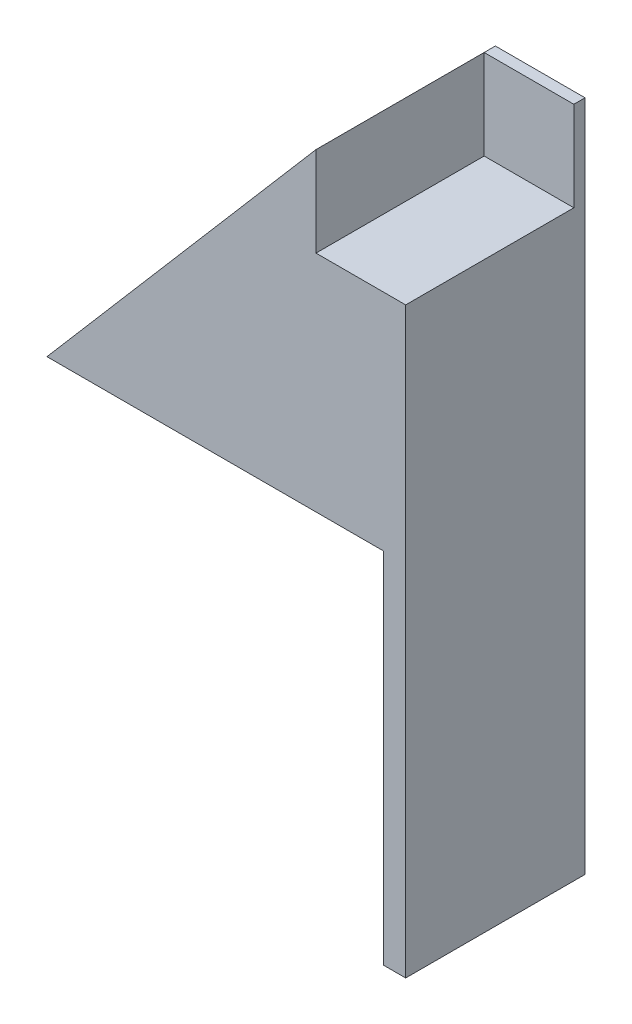
ISO-10303-21;
HEADER;
FILE_DESCRIPTION(('STEP AP214'),'2;1');
FILE_NAME('part.step','',(''),(''),'','','');
FILE_SCHEMA(('AUTOMOTIVE_DESIGN { 1 0 10303 214 1 1 1 1 }'));
ENDSEC;
DATA;
#1=APPLICATION_CONTEXT('core data for automotive mechanical design processes');
#2=APPLICATION_PROTOCOL_DEFINITION('international standard','automotive_design',2000,#1);
#3=PRODUCT_CONTEXT('',#1,'mechanical');
#4=PRODUCT('Part','Part','',(#3));
#5=PRODUCT_RELATED_PRODUCT_CATEGORY('part','',(#4));
#6=PRODUCT_DEFINITION_FORMATION('','',#4);
#7=PRODUCT_DEFINITION_CONTEXT('part definition',#1,'design');
#8=PRODUCT_DEFINITION('design','',#6,#7);
#9=PRODUCT_DEFINITION_SHAPE('','',#8);
#10=(LENGTH_UNIT() NAMED_UNIT(*) SI_UNIT(.MILLI.,.METRE.));
#11=(NAMED_UNIT(*) PLANE_ANGLE_UNIT() SI_UNIT($,.RADIAN.));
#12=(NAMED_UNIT(*) SI_UNIT($,.STERADIAN.) SOLID_ANGLE_UNIT());
#13=UNCERTAINTY_MEASURE_WITH_UNIT(LENGTH_MEASURE(1.E-05),#10,'distance_accuracy_value','');
#14=(GEOMETRIC_REPRESENTATION_CONTEXT(3) GLOBAL_UNCERTAINTY_ASSIGNED_CONTEXT((#13)) GLOBAL_UNIT_ASSIGNED_CONTEXT((#10,
#11,#12)) REPRESENTATION_CONTEXT('',''));
#15=CARTESIAN_POINT('',(0.,0.,0.));
#16=DIRECTION('',(0.,0.,1.));
#17=DIRECTION('',(1.,0.,0.));
#18=AXIS2_PLACEMENT_3D('',#15,#16,#17);
#19=CARTESIAN_POINT('',(9.525,44.45,12.7));
#20=DIRECTION('',(0.,-1.,0.));
#21=DIRECTION('',(0.,0.,-1.));
#22=AXIS2_PLACEMENT_3D('',#19,#20,#21);
#23=PLANE('',#22);
#24=DIRECTION('',(-1.,0.,0.));
#25=VECTOR('',#24,1.);
#26=CARTESIAN_POINT('',(9.525,44.45,-11.1125));
#27=LINE('',#26,#25);
#28=CARTESIAN_POINT('',(22.225,44.45,-11.1125));
#29=VERTEX_POINT('',#28);
#30=CARTESIAN_POINT('',(9.525,44.45,-11.1125));
#31=VERTEX_POINT('',#30);
#32=EDGE_CURVE('E116',#29,#31,#27,.T.);
#33=ORIENTED_EDGE('',*,*,#32,.F.);
#34=DIRECTION('',(0.,0.,-1.));
#35=VECTOR('',#34,1.);
#36=CARTESIAN_POINT('',(22.225,44.45,12.7));
#37=LINE('',#36,#35);
#38=CARTESIAN_POINT('',(22.225,44.45,-12.7));
#39=VERTEX_POINT('',#38);
#40=EDGE_CURVE('E11',#29,#39,#37,.T.);
#41=ORIENTED_EDGE('',*,*,#40,.T.);
#42=DIRECTION('',(-1.,0.,0.));
#43=VECTOR('',#42,1.);
#44=CARTESIAN_POINT('',(9.525,44.45,-12.7));
#45=LINE('',#44,#43);
#46=CARTESIAN_POINT('',(9.525,44.45,-12.7));
#47=VERTEX_POINT('',#46);
#48=EDGE_CURVE('E148',#39,#47,#45,.T.);
#49=ORIENTED_EDGE('',*,*,#48,.T.);
#50=DIRECTION('',(0.,0.,-1.));
#51=VECTOR('',#50,1.);
#52=CARTESIAN_POINT('',(9.525,44.45,12.7));
#53=LINE('',#52,#51);
#54=EDGE_CURVE('E168',#31,#47,#53,.T.);
#55=ORIENTED_EDGE('',*,*,#54,.F.);
#56=EDGE_LOOP('',(#33,#41,#49,#55));
#57=FACE_BOUND('',#56,.T.);
#58=ADVANCED_FACE('F33',(#57),#23,.F.);
#59=CARTESIAN_POINT('',(22.225,44.45,12.7));
#60=DIRECTION('',(-1.,0.,0.));
#61=DIRECTION('',(0.,0.,1.));
#62=AXIS2_PLACEMENT_3D('',#59,#60,#61);
#63=PLANE('',#62);
#64=DIRECTION('',(0.,1.,0.));
#65=VECTOR('',#64,1.);
#66=CARTESIAN_POINT('',(22.225,44.45,-11.1125));
#67=LINE('',#66,#65);
#68=CARTESIAN_POINT('',(22.225,31.75,-11.1125));
#69=VERTEX_POINT('',#68);
#70=EDGE_CURVE('E124',#69,#29,#67,.T.);
#71=ORIENTED_EDGE('',*,*,#70,.F.);
#72=DIRECTION('',(0.,0.,1.));
#73=VECTOR('',#72,1.);
#74=CARTESIAN_POINT('',(22.225,31.75,-11.1125));
#75=LINE('',#74,#73);
#76=CARTESIAN_POINT('',(22.225,31.75,12.7));
#77=VERTEX_POINT('',#76);
#78=EDGE_CURVE('E115',#69,#77,#75,.T.);
#79=ORIENTED_EDGE('',*,*,#78,.T.);
#80=DIRECTION('',(0.,1.,0.));
#81=VECTOR('',#80,1.);
#82=CARTESIAN_POINT('',(22.225,31.75,12.7));
#83=LINE('',#82,#81);
#84=CARTESIAN_POINT('',(22.225,-50.8,12.7));
#85=VERTEX_POINT('',#84);
#86=EDGE_CURVE('E137',#85,#77,#83,.T.);
#87=ORIENTED_EDGE('',*,*,#86,.F.);
#88=DIRECTION('',(0.,0.,-1.));
#89=VECTOR('',#88,1.);
#90=CARTESIAN_POINT('',(22.225,-50.8,12.7));
#91=LINE('',#90,#89);
#92=CARTESIAN_POINT('',(22.225,-50.8,-12.7));
#93=VERTEX_POINT('',#92);
#94=EDGE_CURVE('E146',#85,#93,#91,.T.);
#95=ORIENTED_EDGE('',*,*,#94,.T.);
#96=DIRECTION('',(0.,1.,0.));
#97=VECTOR('',#96,1.);
#98=CARTESIAN_POINT('',(22.225,44.45,-12.7));
#99=LINE('',#98,#97);
#100=EDGE_CURVE('E84',#93,#39,#99,.T.);
#101=ORIENTED_EDGE('',*,*,#100,.T.);
#102=ORIENTED_EDGE('',*,*,#40,.F.);
#103=EDGE_LOOP('',(#71,#79,#87,#95,#101,#102));
#104=FACE_BOUND('',#103,.T.);
#105=ADVANCED_FACE('F35',(#104),#63,.F.);
#106=CARTESIAN_POINT('',(9.525,44.45,12.7));
#107=DIRECTION('',(0.759256602365296,-0.650791373455968,0.));
#108=DIRECTION('',(0.650791373455969,0.759256602365297,0.));
#109=AXIS2_PLACEMENT_3D('',#106,#107,#108);
#110=PLANE('',#109);
#111=DIRECTION('',(-0.650791373455968,-0.759256602365297,0.));
#112=VECTOR('',#111,1.);
#113=CARTESIAN_POINT('',(9.525,44.45,-12.7));
#114=LINE('',#113,#112);
#115=CARTESIAN_POINT('',(-28.575,0.,-12.7));
#116=VERTEX_POINT('',#115);
#117=EDGE_CURVE('E151',#47,#116,#114,.T.);
#118=ORIENTED_EDGE('',*,*,#117,.T.);
#119=DIRECTION('',(0.,0.,-1.));
#120=VECTOR('',#119,1.);
#121=CARTESIAN_POINT('',(-28.575,0.,12.7));
#122=LINE('',#121,#120);
#123=CARTESIAN_POINT('',(-28.575,0.,12.7));
#124=VERTEX_POINT('',#123);
#125=EDGE_CURVE('E166',#124,#116,#122,.T.);
#126=ORIENTED_EDGE('',*,*,#125,.F.);
#127=DIRECTION('',(-0.650791373455968,-0.759256602365297,0.));
#128=VECTOR('',#127,1.);
#129=CARTESIAN_POINT('',(9.525,44.45,12.7));
#130=LINE('',#129,#128);
#131=CARTESIAN_POINT('',(9.525,44.45,12.7));
#132=VERTEX_POINT('',#131);
#133=EDGE_CURVE('E90',#132,#124,#130,.T.);
#134=ORIENTED_EDGE('',*,*,#133,.F.);
#135=EDGE_CURVE('E41',#132,#31,#53,.T.);
#136=ORIENTED_EDGE('',*,*,#135,.T.);
#137=ORIENTED_EDGE('',*,*,#54,.T.);
#138=EDGE_LOOP('',(#118,#126,#134,#136,#137));
#139=FACE_BOUND('',#138,.T.);
#140=ADVANCED_FACE('F171',(#139),#110,.F.);
#141=CARTESIAN_POINT('',(19.05,0.,12.7));
#142=DIRECTION('',(0.,1.,0.));
#143=DIRECTION('',(-1.,0.,0.));
#144=AXIS2_PLACEMENT_3D('',#141,#142,#143);
#145=PLANE('',#144);
#146=DIRECTION('',(1.,0.,0.));
#147=VECTOR('',#146,1.);
#148=CARTESIAN_POINT('',(19.05,0.,-12.7));
#149=LINE('',#148,#147);
#150=CARTESIAN_POINT('',(19.05,0.,-12.7));
#151=VERTEX_POINT('',#150);
#152=EDGE_CURVE('E153',#116,#151,#149,.T.);
#153=ORIENTED_EDGE('',*,*,#152,.T.);
#154=DIRECTION('',(0.,0.,-1.));
#155=VECTOR('',#154,1.);
#156=CARTESIAN_POINT('',(19.05,0.,12.7));
#157=LINE('',#156,#155);
#158=CARTESIAN_POINT('',(19.05,0.,12.7));
#159=VERTEX_POINT('',#158);
#160=EDGE_CURVE('E163',#159,#151,#157,.T.);
#161=ORIENTED_EDGE('',*,*,#160,.F.);
#162=DIRECTION('',(1.,0.,0.));
#163=VECTOR('',#162,1.);
#164=CARTESIAN_POINT('',(19.05,0.,12.7));
#165=LINE('',#164,#163);
#166=EDGE_CURVE('E141',#124,#159,#165,.T.);
#167=ORIENTED_EDGE('',*,*,#166,.F.);
#168=ORIENTED_EDGE('',*,*,#125,.T.);
#169=EDGE_LOOP('',(#153,#161,#167,#168));
#170=FACE_BOUND('',#169,.T.);
#171=ADVANCED_FACE('F180',(#170),#145,.F.);
#172=CARTESIAN_POINT('',(19.05,-50.8,12.7));
#173=DIRECTION('',(1.,0.,0.));
#174=DIRECTION('',(0.,0.,-1.));
#175=AXIS2_PLACEMENT_3D('',#172,#173,#174);
#176=PLANE('',#175);
#177=DIRECTION('',(0.,-1.,0.));
#178=VECTOR('',#177,1.);
#179=CARTESIAN_POINT('',(19.05,-50.8,-12.7));
#180=LINE('',#179,#178);
#181=CARTESIAN_POINT('',(19.05,-50.8,-12.7));
#182=VERTEX_POINT('',#181);
#183=EDGE_CURVE('E155',#151,#182,#180,.T.);
#184=ORIENTED_EDGE('',*,*,#183,.T.);
#185=DIRECTION('',(0.,0.,-1.));
#186=VECTOR('',#185,1.);
#187=CARTESIAN_POINT('',(19.05,-50.8,12.7));
#188=LINE('',#187,#186);
#189=CARTESIAN_POINT('',(19.05,-50.8,12.7));
#190=VERTEX_POINT('',#189);
#191=EDGE_CURVE('E160',#190,#182,#188,.T.);
#192=ORIENTED_EDGE('',*,*,#191,.F.);
#193=DIRECTION('',(0.,-1.,0.));
#194=VECTOR('',#193,1.);
#195=CARTESIAN_POINT('',(19.05,-50.8,12.7));
#196=LINE('',#195,#194);
#197=EDGE_CURVE('E143',#159,#190,#196,.T.);
#198=ORIENTED_EDGE('',*,*,#197,.F.);
#199=ORIENTED_EDGE('',*,*,#160,.T.);
#200=EDGE_LOOP('',(#184,#192,#198,#199));
#201=FACE_BOUND('',#200,.T.);
#202=ADVANCED_FACE('F184',(#201),#176,.F.);
#203=CARTESIAN_POINT('',(19.05,-50.8,12.7));
#204=DIRECTION('',(0.,1.,0.));
#205=DIRECTION('',(0.,0.,1.));
#206=AXIS2_PLACEMENT_3D('',#203,#204,#205);
#207=PLANE('',#206);
#208=DIRECTION('',(1.,0.,0.));
#209=VECTOR('',#208,1.);
#210=CARTESIAN_POINT('',(19.05,-50.8,-12.7));
#211=LINE('',#210,#209);
#212=EDGE_CURVE('E139',#182,#93,#211,.T.);
#213=ORIENTED_EDGE('',*,*,#212,.T.);
#214=ORIENTED_EDGE('',*,*,#94,.F.);
#215=DIRECTION('',(1.,0.,0.));
#216=VECTOR('',#215,1.);
#217=CARTESIAN_POINT('',(19.05,-50.8,12.7));
#218=LINE('',#217,#216);
#219=EDGE_CURVE('E57',#190,#85,#218,.T.);
#220=ORIENTED_EDGE('',*,*,#219,.F.);
#221=ORIENTED_EDGE('',*,*,#191,.T.);
#222=EDGE_LOOP('',(#213,#214,#220,#221));
#223=FACE_BOUND('',#222,.T.);
#224=ADVANCED_FACE('F188',(#223),#207,.F.);
#225=CARTESIAN_POINT('',(0.,0.,12.7));
#226=DIRECTION('',(0.,0.,1.));
#227=DIRECTION('',(1.,0.,0.));
#228=AXIS2_PLACEMENT_3D('',#225,#226,#227);
#229=PLANE('',#228);
#230=DIRECTION('',(0.,-1.,0.));
#231=VECTOR('',#230,1.);
#232=CARTESIAN_POINT('',(9.525,44.45,12.7));
#233=LINE('',#232,#231);
#234=CARTESIAN_POINT('',(9.525,31.75,12.7));
#235=VERTEX_POINT('',#234);
#236=EDGE_CURVE('E48',#132,#235,#233,.T.);
#237=ORIENTED_EDGE('',*,*,#236,.F.);
#238=ORIENTED_EDGE('',*,*,#133,.T.);
#239=ORIENTED_EDGE('',*,*,#166,.T.);
#240=ORIENTED_EDGE('',*,*,#197,.T.);
#241=ORIENTED_EDGE('',*,*,#219,.T.);
#242=ORIENTED_EDGE('',*,*,#86,.T.);
#243=DIRECTION('',(1.,0.,0.));
#244=VECTOR('',#243,1.);
#245=CARTESIAN_POINT('',(9.525,31.75,12.7));
#246=LINE('',#245,#244);
#247=EDGE_CURVE('E129',#235,#77,#246,.T.);
#248=ORIENTED_EDGE('',*,*,#247,.F.);
#249=EDGE_LOOP('',(#237,#238,#239,#240,#241,#242,#248));
#250=FACE_BOUND('',#249,.T.);
#251=ADVANCED_FACE('F186',(#250),#229,.T.);
#252=CARTESIAN_POINT('',(0.,0.,-12.7));
#253=DIRECTION('',(0.,0.,1.));
#254=DIRECTION('',(1.,0.,0.));
#255=AXIS2_PLACEMENT_3D('',#252,#253,#254);
#256=PLANE('',#255);
#257=ORIENTED_EDGE('',*,*,#100,.F.);
#258=ORIENTED_EDGE('',*,*,#212,.F.);
#259=ORIENTED_EDGE('',*,*,#183,.F.);
#260=ORIENTED_EDGE('',*,*,#152,.F.);
#261=ORIENTED_EDGE('',*,*,#117,.F.);
#262=ORIENTED_EDGE('',*,*,#48,.F.);
#263=EDGE_LOOP('',(#257,#258,#259,#260,#261,#262));
#264=FACE_BOUND('',#263,.T.);
#265=ADVANCED_FACE('F176',(#264),#256,.F.);
#266=CARTESIAN_POINT('',(9.525,44.45,-11.1125));
#267=DIRECTION('',(-1.,0.,0.));
#268=DIRECTION('',(0.,-1.,0.));
#269=AXIS2_PLACEMENT_3D('',#266,#267,#268);
#270=PLANE('',#269);
#271=ORIENTED_EDGE('',*,*,#236,.T.);
#272=DIRECTION('',(0.,0.,1.));
#273=VECTOR('',#272,1.);
#274=CARTESIAN_POINT('',(9.525,31.75,-11.1125));
#275=LINE('',#274,#273);
#276=CARTESIAN_POINT('',(9.525,31.75,-11.1125));
#277=VERTEX_POINT('',#276);
#278=EDGE_CURVE('E107',#277,#235,#275,.T.);
#279=ORIENTED_EDGE('',*,*,#278,.F.);
#280=DIRECTION('',(0.,-1.,0.));
#281=VECTOR('',#280,1.);
#282=CARTESIAN_POINT('',(9.525,44.45,-11.1125));
#283=LINE('',#282,#281);
#284=EDGE_CURVE('E111',#31,#277,#283,.T.);
#285=ORIENTED_EDGE('',*,*,#284,.F.);
#286=ORIENTED_EDGE('',*,*,#135,.F.);
#287=EDGE_LOOP('',(#271,#279,#285,#286));
#288=FACE_BOUND('',#287,.T.);
#289=ADVANCED_FACE('F109',(#288),#270,.F.);
#290=CARTESIAN_POINT('',(9.525,31.75,-11.1125));
#291=DIRECTION('',(0.,-1.,0.));
#292=DIRECTION('',(0.,0.,-1.));
#293=AXIS2_PLACEMENT_3D('',#290,#291,#292);
#294=PLANE('',#293);
#295=ORIENTED_EDGE('',*,*,#247,.T.);
#296=ORIENTED_EDGE('',*,*,#78,.F.);
#297=DIRECTION('',(1.,0.,0.));
#298=VECTOR('',#297,1.);
#299=CARTESIAN_POINT('',(9.525,31.75,-11.1125));
#300=LINE('',#299,#298);
#301=EDGE_CURVE('E119',#277,#69,#300,.T.);
#302=ORIENTED_EDGE('',*,*,#301,.F.);
#303=ORIENTED_EDGE('',*,*,#278,.T.);
#304=EDGE_LOOP('',(#295,#296,#302,#303));
#305=FACE_BOUND('',#304,.T.);
#306=ADVANCED_FACE('F120',(#305),#294,.F.);
#307=CARTESIAN_POINT('',(0.,0.,-11.1125));
#308=DIRECTION('',(0.,0.,1.));
#309=DIRECTION('',(1.,0.,0.));
#310=AXIS2_PLACEMENT_3D('',#307,#308,#309);
#311=PLANE('',#310);
#312=ORIENTED_EDGE('',*,*,#284,.T.);
#313=ORIENTED_EDGE('',*,*,#301,.T.);
#314=ORIENTED_EDGE('',*,*,#70,.T.);
#315=ORIENTED_EDGE('',*,*,#32,.T.);
#316=EDGE_LOOP('',(#312,#313,#314,#315));
#317=FACE_BOUND('',#316,.T.);
#318=ADVANCED_FACE('F126',(#317),#311,.T.);
#319=CLOSED_SHELL('',(#58,#105,#140,#171,#202,#224,#251,#265,#289,#306,#318));
#320=MANIFOLD_SOLID_BREP('B2',#319);
#321=ADVANCED_BREP_SHAPE_REPRESENTATION('',(#18,#320),#14);
#322=SHAPE_DEFINITION_REPRESENTATION(#9,#321);
ENDSEC;
END-ISO-10303-21;
